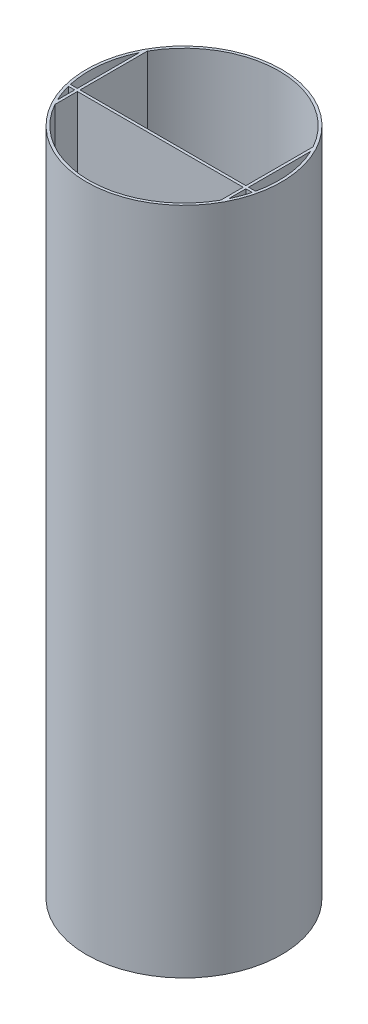
ISO-10303-21;
HEADER;
FILE_DESCRIPTION(('STEP AP214'),'2;1');
FILE_NAME('part.step','',(''),(''),'','','');
FILE_SCHEMA(('AUTOMOTIVE_DESIGN { 1 0 10303 214 1 1 1 1 }'));
ENDSEC;
DATA;
#1=APPLICATION_CONTEXT('core data for automotive mechanical design processes');
#2=APPLICATION_PROTOCOL_DEFINITION('international standard','automotive_design',2000,#1);
#3=PRODUCT_CONTEXT('',#1,'mechanical');
#4=PRODUCT('Part','Part','',(#3));
#5=PRODUCT_RELATED_PRODUCT_CATEGORY('part','',(#4));
#6=PRODUCT_DEFINITION_FORMATION('','',#4);
#7=PRODUCT_DEFINITION_CONTEXT('part definition',#1,'design');
#8=PRODUCT_DEFINITION('design','',#6,#7);
#9=PRODUCT_DEFINITION_SHAPE('','',#8);
#10=(LENGTH_UNIT() NAMED_UNIT(*) SI_UNIT(.MILLI.,.METRE.));
#11=(NAMED_UNIT(*) PLANE_ANGLE_UNIT() SI_UNIT($,.RADIAN.));
#12=(NAMED_UNIT(*) SI_UNIT($,.STERADIAN.) SOLID_ANGLE_UNIT());
#13=UNCERTAINTY_MEASURE_WITH_UNIT(LENGTH_MEASURE(1.E-05),#10,'distance_accuracy_value','');
#14=(GEOMETRIC_REPRESENTATION_CONTEXT(3) GLOBAL_UNCERTAINTY_ASSIGNED_CONTEXT((#13)) GLOBAL_UNIT_ASSIGNED_CONTEXT((#10,
#11,#12)) REPRESENTATION_CONTEXT('',''));
#15=CARTESIAN_POINT('',(0.,0.,0.));
#16=DIRECTION('',(0.,0.,1.));
#17=DIRECTION('',(1.,0.,0.));
#18=AXIS2_PLACEMENT_3D('',#15,#16,#17);
#19=CARTESIAN_POINT('',(0.,500.,0.));
#20=DIRECTION('',(0.,-1.,0.));
#21=DIRECTION('',(0.,0.,-1.));
#22=AXIS2_PLACEMENT_3D('',#19,#20,#21);
#23=CYLINDRICAL_SURFACE('',#22,71.2);
#24=DIRECTION('',(0.,-1.,0.));
#25=VECTOR('',#24,1.);
#26=CARTESIAN_POINT('',(62.2,500.,-34.6496753231542));
#27=LINE('',#26,#25);
#28=CARTESIAN_POINT('',(62.2,40.,-34.6496753231542));
#29=VERTEX_POINT('',#28);
#30=CARTESIAN_POINT('',(62.2,0.,-34.6496753231542));
#31=VERTEX_POINT('',#30);
#32=EDGE_CURVE('E433',#29,#31,#27,.T.);
#33=ORIENTED_EDGE('',*,*,#32,.F.);
#34=CARTESIAN_POINT('',(0.,40.,0.));
#35=DIRECTION('',(0.,1.,0.));
#36=DIRECTION('',(0.,0.,1.));
#37=AXIS2_PLACEMENT_3D('',#34,#35,#36);
#38=CIRCLE('',#37,71.2);
#39=CARTESIAN_POINT('',(-62.2,40.,-34.6496753231542));
#40=VERTEX_POINT('',#39);
#41=EDGE_CURVE('E264',#29,#40,#38,.T.);
#42=ORIENTED_EDGE('',*,*,#41,.T.);
#43=DIRECTION('',(0.,-1.,0.));
#44=VECTOR('',#43,1.);
#45=CARTESIAN_POINT('',(-62.2,500.,-34.6496753231542));
#46=LINE('',#45,#44);
#47=CARTESIAN_POINT('',(-62.2,0.,-34.6496753231542));
#48=VERTEX_POINT('',#47);
#49=EDGE_CURVE('E430',#40,#48,#46,.T.);
#50=ORIENTED_EDGE('',*,*,#49,.T.);
#51=CARTESIAN_POINT('',(0.,0.,0.));
#52=DIRECTION('',(0.,1.,0.));
#53=DIRECTION('',(0.,0.,1.));
#54=AXIS2_PLACEMENT_3D('',#51,#52,#53);
#55=CIRCLE('',#54,71.2);
#56=EDGE_CURVE('E388',#31,#48,#55,.T.);
#57=ORIENTED_EDGE('',*,*,#56,.F.);
#58=EDGE_LOOP('',(#33,#42,#50,#57));
#59=FACE_BOUND('',#58,.T.);
#60=ADVANCED_FACE('F39',(#59),#23,.F.);
#61=CARTESIAN_POINT('',(62.2,500.,0.));
#62=DIRECTION('',(1.,0.,0.));
#63=DIRECTION('',(0.,0.,-1.));
#64=AXIS2_PLACEMENT_3D('',#61,#62,#63);
#65=PLANE('',#64);
#66=DIRECTION('',(0.,0.,-1.));
#67=VECTOR('',#66,1.);
#68=CARTESIAN_POINT('',(62.2,40.,15.8));
#69=LINE('',#68,#67);
#70=CARTESIAN_POINT('',(62.2,40.,15.8));
#71=VERTEX_POINT('',#70);
#72=EDGE_CURVE('E260',#71,#29,#69,.T.);
#73=ORIENTED_EDGE('',*,*,#72,.T.);
#74=ORIENTED_EDGE('',*,*,#32,.T.);
#75=DIRECTION('',(0.,0.,1.));
#76=VECTOR('',#75,1.);
#77=CARTESIAN_POINT('',(62.2,0.,0.));
#78=LINE('',#77,#76);
#79=CARTESIAN_POINT('',(62.2,0.,15.8));
#80=VERTEX_POINT('',#79);
#81=EDGE_CURVE('E391',#31,#80,#78,.T.);
#82=ORIENTED_EDGE('',*,*,#81,.T.);
#83=DIRECTION('',(0.,-1.,0.));
#84=VECTOR('',#83,1.);
#85=CARTESIAN_POINT('',(62.2,500.,15.8));
#86=LINE('',#85,#84);
#87=EDGE_CURVE('E237',#71,#80,#86,.T.);
#88=ORIENTED_EDGE('',*,*,#87,.F.);
#89=EDGE_LOOP('',(#73,#74,#82,#88));
#90=FACE_BOUND('',#89,.T.);
#91=ADVANCED_FACE('F507',(#90),#65,.F.);
#92=CARTESIAN_POINT('',(0.,500.,15.8));
#93=DIRECTION('',(0.,0.,-1.));
#94=DIRECTION('',(-1.,0.,0.));
#95=AXIS2_PLACEMENT_3D('',#92,#93,#94);
#96=PLANE('',#95);
#97=DIRECTION('',(0.,-1.,0.));
#98=VECTOR('',#97,1.);
#99=CARTESIAN_POINT('',(-62.2,500.,15.8));
#100=LINE('',#99,#98);
#101=CARTESIAN_POINT('',(-62.2,40.,15.8));
#102=VERTEX_POINT('',#101);
#103=CARTESIAN_POINT('',(-62.2,0.,15.8));
#104=VERTEX_POINT('',#103);
#105=EDGE_CURVE('E238',#102,#104,#100,.T.);
#106=ORIENTED_EDGE('',*,*,#105,.F.);
#107=DIRECTION('',(1.,0.,0.));
#108=VECTOR('',#107,1.);
#109=CARTESIAN_POINT('',(-62.2,40.,15.8));
#110=LINE('',#109,#108);
#111=EDGE_CURVE('E257',#102,#71,#110,.T.);
#112=ORIENTED_EDGE('',*,*,#111,.T.);
#113=ORIENTED_EDGE('',*,*,#87,.T.);
#114=DIRECTION('',(1.,0.,0.));
#115=VECTOR('',#114,1.);
#116=CARTESIAN_POINT('',(0.,0.,15.8));
#117=LINE('',#116,#115);
#118=EDGE_CURVE('E394',#104,#80,#117,.T.);
#119=ORIENTED_EDGE('',*,*,#118,.F.);
#120=EDGE_LOOP('',(#106,#112,#113,#119));
#121=FACE_BOUND('',#120,.T.);
#122=ADVANCED_FACE('F514',(#121),#96,.T.);
#123=CARTESIAN_POINT('',(-62.2,500.,0.));
#124=DIRECTION('',(1.,0.,0.));
#125=DIRECTION('',(0.,0.,-1.));
#126=AXIS2_PLACEMENT_3D('',#123,#124,#125);
#127=PLANE('',#126);
#128=ORIENTED_EDGE('',*,*,#49,.F.);
#129=DIRECTION('',(0.,0.,1.));
#130=VECTOR('',#129,1.);
#131=CARTESIAN_POINT('',(-62.2,40.,-34.6496753231542));
#132=LINE('',#131,#130);
#133=EDGE_CURVE('E245',#40,#102,#132,.T.);
#134=ORIENTED_EDGE('',*,*,#133,.T.);
#135=ORIENTED_EDGE('',*,*,#105,.T.);
#136=DIRECTION('',(0.,0.,1.));
#137=VECTOR('',#136,1.);
#138=CARTESIAN_POINT('',(-62.2,0.,0.));
#139=LINE('',#138,#137);
#140=EDGE_CURVE('E397',#48,#104,#139,.T.);
#141=ORIENTED_EDGE('',*,*,#140,.F.);
#142=EDGE_LOOP('',(#128,#134,#135,#141));
#143=FACE_BOUND('',#142,.T.);
#144=ADVANCED_FACE('F543',(#143),#127,.T.);
#145=CARTESIAN_POINT('',(0.,500.,0.));
#146=DIRECTION('',(0.,-1.,0.));
#147=DIRECTION('',(0.,0.,-1.));
#148=AXIS2_PLACEMENT_3D('',#145,#146,#147);
#149=CYLINDRICAL_SURFACE('',#148,71.2);
#150=DIRECTION('',(0.,-1.,0.));
#151=VECTOR('',#150,1.);
#152=CARTESIAN_POINT('',(-62.2,500.,34.6496753231542));
#153=LINE('',#152,#151);
#154=CARTESIAN_POINT('',(-62.2,40.,34.6496753231542));
#155=VERTEX_POINT('',#154);
#156=CARTESIAN_POINT('',(-62.2,0.,34.6496753231542));
#157=VERTEX_POINT('',#156);
#158=EDGE_CURVE('E455',#155,#157,#153,.T.);
#159=ORIENTED_EDGE('',*,*,#158,.F.);
#160=CARTESIAN_POINT('',(0.,40.,0.));
#161=DIRECTION('',(0.,1.,0.));
#162=DIRECTION('',(0.,0.,1.));
#163=AXIS2_PLACEMENT_3D('',#160,#161,#162);
#164=CIRCLE('',#163,71.2);
#165=CARTESIAN_POINT('',(62.2,40.,34.6496753231542));
#166=VERTEX_POINT('',#165);
#167=EDGE_CURVE('E285',#155,#166,#164,.T.);
#168=ORIENTED_EDGE('',*,*,#167,.T.);
#169=DIRECTION('',(0.,-1.,0.));
#170=VECTOR('',#169,1.);
#171=CARTESIAN_POINT('',(62.2,500.,34.6496753231542));
#172=LINE('',#171,#170);
#173=CARTESIAN_POINT('',(62.2,0.,34.6496753231542));
#174=VERTEX_POINT('',#173);
#175=EDGE_CURVE('E447',#166,#174,#172,.T.);
#176=ORIENTED_EDGE('',*,*,#175,.T.);
#177=CARTESIAN_POINT('',(0.,0.,0.));
#178=DIRECTION('',(0.,1.,0.));
#179=DIRECTION('',(0.,0.,1.));
#180=AXIS2_PLACEMENT_3D('',#177,#178,#179);
#181=CIRCLE('',#180,71.2);
#182=EDGE_CURVE('E367',#157,#174,#181,.T.);
#183=ORIENTED_EDGE('',*,*,#182,.F.);
#184=EDGE_LOOP('',(#159,#168,#176,#183));
#185=FACE_BOUND('',#184,.T.);
#186=ADVANCED_FACE('F471',(#185),#149,.F.);
#187=CARTESIAN_POINT('',(-62.2,500.,0.));
#188=DIRECTION('',(1.,0.,0.));
#189=DIRECTION('',(0.,0.,-1.));
#190=AXIS2_PLACEMENT_3D('',#187,#188,#189);
#191=PLANE('',#190);
#192=DIRECTION('',(0.,-1.,0.));
#193=VECTOR('',#192,1.);
#194=CARTESIAN_POINT('',(-62.2,500.,17.8));
#195=LINE('',#194,#193);
#196=CARTESIAN_POINT('',(-62.2,40.,17.8));
#197=VERTEX_POINT('',#196);
#198=CARTESIAN_POINT('',(-62.2,0.,17.8));
#199=VERTEX_POINT('',#198);
#200=EDGE_CURVE('E451',#197,#199,#195,.T.);
#201=ORIENTED_EDGE('',*,*,#200,.F.);
#202=DIRECTION('',(0.,0.,1.));
#203=VECTOR('',#202,1.);
#204=CARTESIAN_POINT('',(-62.2,40.,17.8));
#205=LINE('',#204,#203);
#206=EDGE_CURVE('E283',#197,#155,#205,.T.);
#207=ORIENTED_EDGE('',*,*,#206,.T.);
#208=ORIENTED_EDGE('',*,*,#158,.T.);
#209=DIRECTION('',(0.,0.,1.));
#210=VECTOR('',#209,1.);
#211=CARTESIAN_POINT('',(-62.2,0.,0.));
#212=LINE('',#211,#210);
#213=EDGE_CURVE('E370',#199,#157,#212,.T.);
#214=ORIENTED_EDGE('',*,*,#213,.F.);
#215=EDGE_LOOP('',(#201,#207,#208,#214));
#216=FACE_BOUND('',#215,.T.);
#217=ADVANCED_FACE('F484',(#216),#191,.T.);
#218=CARTESIAN_POINT('',(0.,500.,17.8));
#219=DIRECTION('',(0.,0.,-1.));
#220=DIRECTION('',(-1.,0.,0.));
#221=AXIS2_PLACEMENT_3D('',#218,#219,#220);
#222=PLANE('',#221);
#223=DIRECTION('',(-1.,0.,0.));
#224=VECTOR('',#223,1.);
#225=CARTESIAN_POINT('',(62.2,40.,17.8));
#226=LINE('',#225,#224);
#227=CARTESIAN_POINT('',(62.2,40.,17.8));
#228=VERTEX_POINT('',#227);
#229=EDGE_CURVE('E270',#228,#197,#226,.T.);
#230=ORIENTED_EDGE('',*,*,#229,.T.);
#231=ORIENTED_EDGE('',*,*,#200,.T.);
#232=DIRECTION('',(1.,0.,0.));
#233=VECTOR('',#232,1.);
#234=CARTESIAN_POINT('',(0.,0.,17.8));
#235=LINE('',#234,#233);
#236=CARTESIAN_POINT('',(62.2,0.,17.8));
#237=VERTEX_POINT('',#236);
#238=EDGE_CURVE('E373',#199,#237,#235,.T.);
#239=ORIENTED_EDGE('',*,*,#238,.T.);
#240=DIRECTION('',(0.,-1.,0.));
#241=VECTOR('',#240,1.);
#242=CARTESIAN_POINT('',(62.2,500.,17.8));
#243=LINE('',#242,#241);
#244=EDGE_CURVE('E446',#228,#237,#243,.T.);
#245=ORIENTED_EDGE('',*,*,#244,.F.);
#246=EDGE_LOOP('',(#230,#231,#239,#245));
#247=FACE_BOUND('',#246,.T.);
#248=ADVANCED_FACE('F491',(#247),#222,.F.);
#249=CARTESIAN_POINT('',(62.2,500.,0.));
#250=DIRECTION('',(1.,0.,0.));
#251=DIRECTION('',(0.,0.,-1.));
#252=AXIS2_PLACEMENT_3D('',#249,#250,#251);
#253=PLANE('',#252);
#254=DIRECTION('',(0.,0.,-1.));
#255=VECTOR('',#254,1.);
#256=CARTESIAN_POINT('',(62.2,40.,34.6496753231542));
#257=LINE('',#256,#255);
#258=EDGE_CURVE('E275',#166,#228,#257,.T.);
#259=ORIENTED_EDGE('',*,*,#258,.T.);
#260=ORIENTED_EDGE('',*,*,#244,.T.);
#261=DIRECTION('',(0.,0.,1.));
#262=VECTOR('',#261,1.);
#263=CARTESIAN_POINT('',(62.2,0.,0.));
#264=LINE('',#263,#262);
#265=EDGE_CURVE('E376',#237,#174,#264,.T.);
#266=ORIENTED_EDGE('',*,*,#265,.T.);
#267=ORIENTED_EDGE('',*,*,#175,.F.);
#268=EDGE_LOOP('',(#259,#260,#266,#267));
#269=FACE_BOUND('',#268,.T.);
#270=ADVANCED_FACE('F476',(#269),#253,.F.);
#271=CARTESIAN_POINT('',(0.,500.,0.));
#272=DIRECTION('',(0.,-1.,0.));
#273=DIRECTION('',(0.,0.,-1.));
#274=AXIS2_PLACEMENT_3D('',#271,#272,#273);
#275=CYLINDRICAL_SURFACE('',#274,71.2);
#276=CARTESIAN_POINT('',(0.,0.,0.));
#277=DIRECTION('',(0.,1.,0.));
#278=DIRECTION('',(0.,0.,1.));
#279=AXIS2_PLACEMENT_3D('',#276,#277,#278);
#280=CIRCLE('',#279,71.2);
#281=CARTESIAN_POINT('',(-68.939103562492,0.,17.8));
#282=VERTEX_POINT('',#281);
#283=CARTESIAN_POINT('',(-64.2,0.,30.7863606163509));
#284=VERTEX_POINT('',#283);
#285=EDGE_CURVE('E409',#282,#284,#280,.T.);
#286=ORIENTED_EDGE('',*,*,#285,.F.);
#287=DIRECTION('',(0.,-1.,0.));
#288=VECTOR('',#287,1.);
#289=CARTESIAN_POINT('',(-68.939103562492,500.,17.8));
#290=LINE('',#289,#288);
#291=CARTESIAN_POINT('',(-68.939103562492,500.,17.8));
#292=VERTEX_POINT('',#291);
#293=EDGE_CURVE('E11',#292,#282,#290,.T.);
#294=ORIENTED_EDGE('',*,*,#293,.F.);
#295=CARTESIAN_POINT('',(0.,500.,0.));
#296=DIRECTION('',(0.,1.,0.));
#297=DIRECTION('',(0.,0.,1.));
#298=AXIS2_PLACEMENT_3D('',#295,#296,#297);
#299=CIRCLE('',#298,71.2);
#300=CARTESIAN_POINT('',(-64.2,500.,30.7863606163509));
#301=VERTEX_POINT('',#300);
#302=EDGE_CURVE('E349',#292,#301,#299,.T.);
#303=ORIENTED_EDGE('',*,*,#302,.T.);
#304=DIRECTION('',(0.,-1.,0.));
#305=VECTOR('',#304,1.);
#306=CARTESIAN_POINT('',(-64.2,500.,30.7863606163509));
#307=LINE('',#306,#305);
#308=EDGE_CURVE('E416',#301,#284,#307,.T.);
#309=ORIENTED_EDGE('',*,*,#308,.T.);
#310=EDGE_LOOP('',(#286,#294,#303,#309));
#311=FACE_BOUND('',#310,.T.);
#312=ADVANCED_FACE('F499',(#311),#275,.F.);
#313=CARTESIAN_POINT('',(0.,500.,17.8));
#314=DIRECTION('',(0.,0.,-1.));
#315=DIRECTION('',(-1.,0.,0.));
#316=AXIS2_PLACEMENT_3D('',#313,#314,#315);
#317=PLANE('',#316);
#318=DIRECTION('',(1.,0.,0.));
#319=VECTOR('',#318,1.);
#320=CARTESIAN_POINT('',(0.,0.,17.8));
#321=LINE('',#320,#319);
#322=CARTESIAN_POINT('',(-64.2,0.,17.8));
#323=VERTEX_POINT('',#322);
#324=EDGE_CURVE('E411',#282,#323,#321,.T.);
#325=ORIENTED_EDGE('',*,*,#324,.T.);
#326=DIRECTION('',(0.,-1.,0.));
#327=VECTOR('',#326,1.);
#328=CARTESIAN_POINT('',(-64.2,500.,17.8));
#329=LINE('',#328,#327);
#330=CARTESIAN_POINT('',(-64.2,500.,17.8));
#331=VERTEX_POINT('',#330);
#332=EDGE_CURVE('E48',#331,#323,#329,.T.);
#333=ORIENTED_EDGE('',*,*,#332,.F.);
#334=DIRECTION('',(1.,0.,0.));
#335=VECTOR('',#334,1.);
#336=CARTESIAN_POINT('',(0.,500.,17.8));
#337=LINE('',#336,#335);
#338=EDGE_CURVE('E352',#292,#331,#337,.T.);
#339=ORIENTED_EDGE('',*,*,#338,.F.);
#340=ORIENTED_EDGE('',*,*,#293,.T.);
#341=EDGE_LOOP('',(#325,#333,#339,#340));
#342=FACE_BOUND('',#341,.T.);
#343=ADVANCED_FACE('F532',(#342),#317,.F.);
#344=CARTESIAN_POINT('',(0.,500.,0.));
#345=DIRECTION('',(0.,-1.,0.));
#346=DIRECTION('',(0.,0.,-1.));
#347=AXIS2_PLACEMENT_3D('',#344,#345,#346);
#348=CYLINDRICAL_SURFACE('',#347,71.2);
#349=CARTESIAN_POINT('',(0.,0.,0.));
#350=DIRECTION('',(0.,1.,0.));
#351=DIRECTION('',(0.,0.,1.));
#352=AXIS2_PLACEMENT_3D('',#349,#350,#351);
#353=CIRCLE('',#352,71.2);
#354=CARTESIAN_POINT('',(69.4247794378924,0.,15.8));
#355=VERTEX_POINT('',#354);
#356=CARTESIAN_POINT('',(64.2,0.,-30.7863606163508));
#357=VERTEX_POINT('',#356);
#358=EDGE_CURVE('E400',#355,#357,#353,.T.);
#359=ORIENTED_EDGE('',*,*,#358,.F.);
#360=DIRECTION('',(0.,-1.,0.));
#361=VECTOR('',#360,1.);
#362=CARTESIAN_POINT('',(69.4247794378924,500.,15.8));
#363=LINE('',#362,#361);
#364=CARTESIAN_POINT('',(69.4247794378924,500.,15.8));
#365=VERTEX_POINT('',#364);
#366=EDGE_CURVE('E419',#365,#355,#363,.T.);
#367=ORIENTED_EDGE('',*,*,#366,.F.);
#368=CARTESIAN_POINT('',(0.,500.,0.));
#369=DIRECTION('',(0.,1.,0.));
#370=DIRECTION('',(0.,0.,1.));
#371=AXIS2_PLACEMENT_3D('',#368,#369,#370);
#372=CIRCLE('',#371,71.2);
#373=CARTESIAN_POINT('',(64.2,500.,-30.7863606163508));
#374=VERTEX_POINT('',#373);
#375=EDGE_CURVE('E340',#365,#374,#372,.T.);
#376=ORIENTED_EDGE('',*,*,#375,.T.);
#377=DIRECTION('',(0.,-1.,0.));
#378=VECTOR('',#377,1.);
#379=CARTESIAN_POINT('',(64.2,500.,-30.7863606163508));
#380=LINE('',#379,#378);
#381=EDGE_CURVE('E422',#374,#357,#380,.T.);
#382=ORIENTED_EDGE('',*,*,#381,.T.);
#383=EDGE_LOOP('',(#359,#367,#376,#382));
#384=FACE_BOUND('',#383,.T.);
#385=ADVANCED_FACE('F526',(#384),#348,.F.);
#386=CARTESIAN_POINT('',(0.,500.,15.8));
#387=DIRECTION('',(0.,0.,-1.));
#388=DIRECTION('',(-1.,0.,0.));
#389=AXIS2_PLACEMENT_3D('',#386,#387,#388);
#390=PLANE('',#389);
#391=DIRECTION('',(1.,0.,0.));
#392=VECTOR('',#391,1.);
#393=CARTESIAN_POINT('',(0.,0.,15.8));
#394=LINE('',#393,#392);
#395=CARTESIAN_POINT('',(64.2,0.,15.8));
#396=VERTEX_POINT('',#395);
#397=EDGE_CURVE('E403',#396,#355,#394,.T.);
#398=ORIENTED_EDGE('',*,*,#397,.F.);
#399=DIRECTION('',(0.,-1.,0.));
#400=VECTOR('',#399,1.);
#401=CARTESIAN_POINT('',(64.2,500.,15.8));
#402=LINE('',#401,#400);
#403=CARTESIAN_POINT('',(64.2,500.,15.8));
#404=VERTEX_POINT('',#403);
#405=EDGE_CURVE('E424',#404,#396,#402,.T.);
#406=ORIENTED_EDGE('',*,*,#405,.F.);
#407=DIRECTION('',(1.,0.,0.));
#408=VECTOR('',#407,1.);
#409=CARTESIAN_POINT('',(0.,500.,15.8));
#410=LINE('',#409,#408);
#411=EDGE_CURVE('E343',#404,#365,#410,.T.);
#412=ORIENTED_EDGE('',*,*,#411,.T.);
#413=ORIENTED_EDGE('',*,*,#366,.T.);
#414=EDGE_LOOP('',(#398,#406,#412,#413));
#415=FACE_BOUND('',#414,.T.);
#416=ADVANCED_FACE('F521',(#415),#390,.T.);
#417=CARTESIAN_POINT('',(0.,42.,0.));
#418=DIRECTION('',(0.,1.,0.));
#419=DIRECTION('',(0.,0.,1.));
#420=AXIS2_PLACEMENT_3D('',#417,#418,#419);
#421=CIRCLE('',#420,71.2);
#422=CARTESIAN_POINT('',(62.2,42.,-34.6496753231542));
#423=VERTEX_POINT('',#422);
#424=CARTESIAN_POINT('',(-62.2,42.,-34.6496753231542));
#425=VERTEX_POINT('',#424);
#426=EDGE_CURVE('E56',#423,#425,#421,.T.);
#427=ORIENTED_EDGE('',*,*,#426,.F.);
#428=CARTESIAN_POINT('',(62.2,500.,-34.6496753231542));
#429=VERTEX_POINT('',#428);
#430=EDGE_CURVE('E425',#429,#423,#27,.T.);
#431=ORIENTED_EDGE('',*,*,#430,.F.);
#432=CARTESIAN_POINT('',(0.,500.,0.));
#433=DIRECTION('',(0.,1.,0.));
#434=DIRECTION('',(0.,0.,1.));
#435=AXIS2_PLACEMENT_3D('',#432,#433,#434);
#436=CIRCLE('',#435,71.2);
#437=CARTESIAN_POINT('',(-62.2,500.,-34.6496753231542));
#438=VERTEX_POINT('',#437);
#439=EDGE_CURVE('E332',#429,#438,#436,.T.);
#440=ORIENTED_EDGE('',*,*,#439,.T.);
#441=EDGE_CURVE('E429',#438,#425,#46,.T.);
#442=ORIENTED_EDGE('',*,*,#441,.T.);
#443=EDGE_LOOP('',(#427,#431,#440,#442));
#444=FACE_BOUND('',#443,.T.);
#445=ADVANCED_FACE('F510',(#444),#23,.F.);
#446=ORIENTED_EDGE('',*,*,#430,.T.);
#447=DIRECTION('',(0.,0.,-1.));
#448=VECTOR('',#447,1.);
#449=CARTESIAN_POINT('',(62.2,42.,15.8));
#450=LINE('',#449,#448);
#451=CARTESIAN_POINT('',(62.2,42.,15.8));
#452=VERTEX_POINT('',#451);
#453=EDGE_CURVE('E63',#452,#423,#450,.T.);
#454=ORIENTED_EDGE('',*,*,#453,.F.);
#455=CARTESIAN_POINT('',(62.2,500.,15.8));
#456=VERTEX_POINT('',#455);
#457=EDGE_CURVE('E243',#456,#452,#86,.T.);
#458=ORIENTED_EDGE('',*,*,#457,.F.);
#459=DIRECTION('',(0.,0.,1.));
#460=VECTOR('',#459,1.);
#461=CARTESIAN_POINT('',(62.2,500.,0.));
#462=LINE('',#461,#460);
#463=EDGE_CURVE('E335',#429,#456,#462,.T.);
#464=ORIENTED_EDGE('',*,*,#463,.F.);
#465=EDGE_LOOP('',(#446,#454,#458,#464));
#466=FACE_BOUND('',#465,.T.);
#467=ADVANCED_FACE('F517',(#466),#65,.F.);
#468=DIRECTION('',(1.,0.,0.));
#469=VECTOR('',#468,1.);
#470=CARTESIAN_POINT('',(-62.2,42.,15.8));
#471=LINE('',#470,#469);
#472=CARTESIAN_POINT('',(-62.2,42.,15.8));
#473=VERTEX_POINT('',#472);
#474=EDGE_CURVE('E241',#473,#452,#471,.T.);
#475=ORIENTED_EDGE('',*,*,#474,.F.);
#476=CARTESIAN_POINT('',(-62.2,500.,15.8));
#477=VERTEX_POINT('',#476);
#478=EDGE_CURVE('E227',#477,#473,#100,.T.);
#479=ORIENTED_EDGE('',*,*,#478,.F.);
#480=DIRECTION('',(1.,0.,0.));
#481=VECTOR('',#480,1.);
#482=CARTESIAN_POINT('',(0.,500.,15.8));
#483=LINE('',#482,#481);
#484=EDGE_CURVE('E337',#477,#456,#483,.T.);
#485=ORIENTED_EDGE('',*,*,#484,.T.);
#486=ORIENTED_EDGE('',*,*,#457,.T.);
#487=EDGE_LOOP('',(#475,#479,#485,#486));
#488=FACE_BOUND('',#487,.T.);
#489=ADVANCED_FACE('F242',(#488),#96,.T.);
#490=CARTESIAN_POINT('',(0.,500.,0.));
#491=DIRECTION('',(0.,-1.,0.));
#492=DIRECTION('',(0.,0.,-1.));
#493=AXIS2_PLACEMENT_3D('',#490,#491,#492);
#494=CYLINDRICAL_SURFACE('',#493,71.2);
#495=CARTESIAN_POINT('',(0.,0.,0.));
#496=DIRECTION('',(0.,1.,0.));
#497=DIRECTION('',(0.,0.,1.));
#498=AXIS2_PLACEMENT_3D('',#495,#496,#497);
#499=CIRCLE('',#498,71.2);
#500=CARTESIAN_POINT('',(64.2,0.,30.7863606163508));
#501=VERTEX_POINT('',#500);
#502=CARTESIAN_POINT('',(68.939103562492,0.,17.8));
#503=VERTEX_POINT('',#502);
#504=EDGE_CURVE('E379',#501,#503,#499,.T.);
#505=ORIENTED_EDGE('',*,*,#504,.F.);
#506=DIRECTION('',(0.,-1.,0.));
#507=VECTOR('',#506,1.);
#508=CARTESIAN_POINT('',(64.2,500.,30.7863606163508));
#509=LINE('',#508,#507);
#510=CARTESIAN_POINT('',(64.2,500.,30.7863606163508));
#511=VERTEX_POINT('',#510);
#512=EDGE_CURVE('E440',#511,#501,#509,.T.);
#513=ORIENTED_EDGE('',*,*,#512,.F.);
#514=CARTESIAN_POINT('',(0.,500.,0.));
#515=DIRECTION('',(0.,1.,0.));
#516=DIRECTION('',(0.,0.,1.));
#517=AXIS2_PLACEMENT_3D('',#514,#515,#516);
#518=CIRCLE('',#517,71.2);
#519=CARTESIAN_POINT('',(68.939103562492,500.,17.8));
#520=VERTEX_POINT('',#519);
#521=EDGE_CURVE('E324',#511,#520,#518,.T.);
#522=ORIENTED_EDGE('',*,*,#521,.T.);
#523=DIRECTION('',(0.,-1.,0.));
#524=VECTOR('',#523,1.);
#525=CARTESIAN_POINT('',(68.939103562492,500.,17.8));
#526=LINE('',#525,#524);
#527=EDGE_CURVE('E435',#520,#503,#526,.T.);
#528=ORIENTED_EDGE('',*,*,#527,.T.);
#529=EDGE_LOOP('',(#505,#513,#522,#528));
#530=FACE_BOUND('',#529,.T.);
#531=ADVANCED_FACE('F545',(#530),#494,.F.);
#532=CARTESIAN_POINT('',(64.2,500.,0.));
#533=DIRECTION('',(1.,0.,0.));
#534=DIRECTION('',(0.,0.,-1.));
#535=AXIS2_PLACEMENT_3D('',#532,#533,#534);
#536=PLANE('',#535);
#537=DIRECTION('',(0.,0.,1.));
#538=VECTOR('',#537,1.);
#539=CARTESIAN_POINT('',(64.2,0.,0.));
#540=LINE('',#539,#538);
#541=CARTESIAN_POINT('',(64.2,0.,17.8));
#542=VERTEX_POINT('',#541);
#543=EDGE_CURVE('E382',#542,#501,#540,.T.);
#544=ORIENTED_EDGE('',*,*,#543,.F.);
#545=DIRECTION('',(0.,-1.,0.));
#546=VECTOR('',#545,1.);
#547=CARTESIAN_POINT('',(64.2,500.,17.8));
#548=LINE('',#547,#546);
#549=CARTESIAN_POINT('',(64.2,500.,17.8));
#550=VERTEX_POINT('',#549);
#551=EDGE_CURVE('E437',#550,#542,#548,.T.);
#552=ORIENTED_EDGE('',*,*,#551,.F.);
#553=DIRECTION('',(0.,0.,1.));
#554=VECTOR('',#553,1.);
#555=CARTESIAN_POINT('',(64.2,500.,0.));
#556=LINE('',#555,#554);
#557=EDGE_CURVE('E327',#550,#511,#556,.T.);
#558=ORIENTED_EDGE('',*,*,#557,.T.);
#559=ORIENTED_EDGE('',*,*,#512,.T.);
#560=EDGE_LOOP('',(#544,#552,#558,#559));
#561=FACE_BOUND('',#560,.T.);
#562=ADVANCED_FACE('F549',(#561),#536,.T.);
#563=CARTESIAN_POINT('',(0.,42.,0.));
#564=DIRECTION('',(0.,1.,0.));
#565=DIRECTION('',(0.,0.,1.));
#566=AXIS2_PLACEMENT_3D('',#563,#564,#565);
#567=CIRCLE('',#566,71.2);
#568=CARTESIAN_POINT('',(-62.2,42.,34.6496753231542));
#569=VERTEX_POINT('',#568);
#570=CARTESIAN_POINT('',(62.2,42.,34.6496753231542));
#571=VERTEX_POINT('',#570);
#572=EDGE_CURVE('E277',#569,#571,#567,.T.);
#573=ORIENTED_EDGE('',*,*,#572,.F.);
#574=CARTESIAN_POINT('',(-62.2,500.,34.6496753231542));
#575=VERTEX_POINT('',#574);
#576=EDGE_CURVE('E438',#575,#569,#153,.T.);
#577=ORIENTED_EDGE('',*,*,#576,.F.);
#578=CARTESIAN_POINT('',(0.,500.,0.));
#579=DIRECTION('',(0.,1.,0.));
#580=DIRECTION('',(0.,0.,1.));
#581=AXIS2_PLACEMENT_3D('',#578,#579,#580);
#582=CIRCLE('',#581,71.2);
#583=CARTESIAN_POINT('',(62.2,500.,34.6496753231542));
#584=VERTEX_POINT('',#583);
#585=EDGE_CURVE('E313',#575,#584,#582,.T.);
#586=ORIENTED_EDGE('',*,*,#585,.T.);
#587=EDGE_CURVE('E443',#584,#571,#172,.T.);
#588=ORIENTED_EDGE('',*,*,#587,.T.);
#589=EDGE_LOOP('',(#573,#577,#586,#588));
#590=FACE_BOUND('',#589,.T.);
#591=ADVANCED_FACE('F790',(#590),#149,.F.);
#592=DIRECTION('',(0.,0.,1.));
#593=VECTOR('',#592,1.);
#594=CARTESIAN_POINT('',(-62.2,42.,17.8));
#595=LINE('',#594,#593);
#596=CARTESIAN_POINT('',(-62.2,42.,17.8));
#597=VERTEX_POINT('',#596);
#598=EDGE_CURVE('E274',#597,#569,#595,.T.);
#599=ORIENTED_EDGE('',*,*,#598,.F.);
#600=CARTESIAN_POINT('',(-62.2,500.,17.8));
#601=VERTEX_POINT('',#600);
#602=EDGE_CURVE('E452',#601,#597,#195,.T.);
#603=ORIENTED_EDGE('',*,*,#602,.F.);
#604=DIRECTION('',(0.,0.,1.));
#605=VECTOR('',#604,1.);
#606=CARTESIAN_POINT('',(-62.2,500.,0.));
#607=LINE('',#606,#605);
#608=EDGE_CURVE('E316',#601,#575,#607,.T.);
#609=ORIENTED_EDGE('',*,*,#608,.T.);
#610=ORIENTED_EDGE('',*,*,#576,.T.);
#611=EDGE_LOOP('',(#599,#603,#609,#610));
#612=FACE_BOUND('',#611,.T.);
#613=ADVANCED_FACE('F503',(#612),#191,.T.);
#614=ORIENTED_EDGE('',*,*,#602,.T.);
#615=DIRECTION('',(-1.,0.,0.));
#616=VECTOR('',#615,1.);
#617=CARTESIAN_POINT('',(62.2,42.,17.8));
#618=LINE('',#617,#616);
#619=CARTESIAN_POINT('',(62.2,42.,17.8));
#620=VERTEX_POINT('',#619);
#621=EDGE_CURVE('E272',#620,#597,#618,.T.);
#622=ORIENTED_EDGE('',*,*,#621,.F.);
#623=CARTESIAN_POINT('',(62.2,500.,17.8));
#624=VERTEX_POINT('',#623);
#625=EDGE_CURVE('E448',#624,#620,#243,.T.);
#626=ORIENTED_EDGE('',*,*,#625,.F.);
#627=DIRECTION('',(1.,0.,0.));
#628=VECTOR('',#627,1.);
#629=CARTESIAN_POINT('',(0.,500.,17.8));
#630=LINE('',#629,#628);
#631=EDGE_CURVE('E319',#601,#624,#630,.T.);
#632=ORIENTED_EDGE('',*,*,#631,.F.);
#633=EDGE_LOOP('',(#614,#622,#626,#632));
#634=FACE_BOUND('',#633,.T.);
#635=ADVANCED_FACE('F494',(#634),#222,.F.);
#636=CARTESIAN_POINT('',(0.,500.,0.));
#637=DIRECTION('',(0.,-1.,0.));
#638=DIRECTION('',(0.,0.,-1.));
#639=AXIS2_PLACEMENT_3D('',#636,#637,#638);
#640=CYLINDRICAL_SURFACE('',#639,71.2);
#641=CARTESIAN_POINT('',(0.,0.,0.));
#642=DIRECTION('',(0.,1.,0.));
#643=DIRECTION('',(0.,0.,1.));
#644=AXIS2_PLACEMENT_3D('',#641,#642,#643);
#645=CIRCLE('',#644,71.2);
#646=CARTESIAN_POINT('',(-64.2,0.,-30.7863606163509));
#647=VERTEX_POINT('',#646);
#648=CARTESIAN_POINT('',(-69.4247794378924,0.,15.8));
#649=VERTEX_POINT('',#648);
#650=EDGE_CURVE('E303',#647,#649,#645,.T.);
#651=ORIENTED_EDGE('',*,*,#650,.F.);
#652=DIRECTION('',(0.,-1.,0.));
#653=VECTOR('',#652,1.);
#654=CARTESIAN_POINT('',(-64.2,500.,-30.7863606163509));
#655=LINE('',#654,#653);
#656=CARTESIAN_POINT('',(-64.2,500.,-30.7863606163509));
#657=VERTEX_POINT('',#656);
#658=EDGE_CURVE('E43',#657,#647,#655,.T.);
#659=ORIENTED_EDGE('',*,*,#658,.F.);
#660=CARTESIAN_POINT('',(0.,500.,0.));
#661=DIRECTION('',(0.,1.,0.));
#662=DIRECTION('',(0.,0.,1.));
#663=AXIS2_PLACEMENT_3D('',#660,#661,#662);
#664=CIRCLE('',#663,71.2);
#665=CARTESIAN_POINT('',(-69.4247794378924,500.,15.8));
#666=VERTEX_POINT('',#665);
#667=EDGE_CURVE('E304',#657,#666,#664,.T.);
#668=ORIENTED_EDGE('',*,*,#667,.T.);
#669=DIRECTION('',(0.,-1.,0.));
#670=VECTOR('',#669,1.);
#671=CARTESIAN_POINT('',(-69.4247794378924,500.,15.8));
#672=LINE('',#671,#670);
#673=EDGE_CURVE('E360',#666,#649,#672,.T.);
#674=ORIENTED_EDGE('',*,*,#673,.T.);
#675=EDGE_LOOP('',(#651,#659,#668,#674));
#676=FACE_BOUND('',#675,.T.);
#677=ADVANCED_FACE('F41',(#676),#640,.F.);
#678=CARTESIAN_POINT('',(-64.2,500.,0.));
#679=DIRECTION('',(1.,0.,0.));
#680=DIRECTION('',(0.,0.,-1.));
#681=AXIS2_PLACEMENT_3D('',#678,#679,#680);
#682=PLANE('',#681);
#683=DIRECTION('',(0.,0.,1.));
#684=VECTOR('',#683,1.);
#685=CARTESIAN_POINT('',(-64.2,0.,0.));
#686=LINE('',#685,#684);
#687=CARTESIAN_POINT('',(-64.2,0.,15.8));
#688=VERTEX_POINT('',#687);
#689=EDGE_CURVE('E362',#647,#688,#686,.T.);
#690=ORIENTED_EDGE('',*,*,#689,.T.);
#691=DIRECTION('',(0.,-1.,0.));
#692=VECTOR('',#691,1.);
#693=CARTESIAN_POINT('',(-64.2,500.,15.8));
#694=LINE('',#693,#692);
#695=CARTESIAN_POINT('',(-64.2,500.,15.8));
#696=VERTEX_POINT('',#695);
#697=EDGE_CURVE('E459',#696,#688,#694,.T.);
#698=ORIENTED_EDGE('',*,*,#697,.F.);
#699=DIRECTION('',(0.,0.,1.));
#700=VECTOR('',#699,1.);
#701=CARTESIAN_POINT('',(-64.2,500.,0.));
#702=LINE('',#701,#700);
#703=EDGE_CURVE('E307',#657,#696,#702,.T.);
#704=ORIENTED_EDGE('',*,*,#703,.F.);
#705=ORIENTED_EDGE('',*,*,#658,.T.);
#706=EDGE_LOOP('',(#690,#698,#704,#705));
#707=FACE_BOUND('',#706,.T.);
#708=ADVANCED_FACE('F629',(#707),#682,.F.);
#709=CARTESIAN_POINT('',(-64.2,500.,0.));
#710=DIRECTION('',(1.,0.,0.));
#711=DIRECTION('',(0.,0.,-1.));
#712=AXIS2_PLACEMENT_3D('',#709,#710,#711);
#713=PLANE('',#712);
#714=DIRECTION('',(0.,0.,1.));
#715=VECTOR('',#714,1.);
#716=CARTESIAN_POINT('',(-64.2,0.,0.));
#717=LINE('',#716,#715);
#718=EDGE_CURVE('E308',#323,#284,#717,.T.);
#719=ORIENTED_EDGE('',*,*,#718,.T.);
#720=ORIENTED_EDGE('',*,*,#308,.F.);
#721=DIRECTION('',(0.,0.,1.));
#722=VECTOR('',#721,1.);
#723=CARTESIAN_POINT('',(-64.2,500.,0.));
#724=LINE('',#723,#722);
#725=EDGE_CURVE('E355',#331,#301,#724,.T.);
#726=ORIENTED_EDGE('',*,*,#725,.F.);
#727=ORIENTED_EDGE('',*,*,#332,.T.);
#728=EDGE_LOOP('',(#719,#720,#726,#727));
#729=FACE_BOUND('',#728,.T.);
#730=ADVANCED_FACE('F626',(#729),#713,.F.);
#731=CARTESIAN_POINT('',(64.2,500.,0.));
#732=DIRECTION('',(1.,0.,0.));
#733=DIRECTION('',(0.,0.,-1.));
#734=AXIS2_PLACEMENT_3D('',#731,#732,#733);
#735=PLANE('',#734);
#736=DIRECTION('',(0.,0.,1.));
#737=VECTOR('',#736,1.);
#738=CARTESIAN_POINT('',(64.2,0.,0.));
#739=LINE('',#738,#737);
#740=EDGE_CURVE('E406',#357,#396,#739,.T.);
#741=ORIENTED_EDGE('',*,*,#740,.F.);
#742=ORIENTED_EDGE('',*,*,#381,.F.);
#743=DIRECTION('',(0.,0.,1.));
#744=VECTOR('',#743,1.);
#745=CARTESIAN_POINT('',(64.2,500.,0.));
#746=LINE('',#745,#744);
#747=EDGE_CURVE('E346',#374,#404,#746,.T.);
#748=ORIENTED_EDGE('',*,*,#747,.T.);
#749=ORIENTED_EDGE('',*,*,#405,.T.);
#750=EDGE_LOOP('',(#741,#742,#748,#749));
#751=FACE_BOUND('',#750,.T.);
#752=ADVANCED_FACE('F537',(#751),#735,.T.);
#753=DIRECTION('',(0.,0.,1.));
#754=VECTOR('',#753,1.);
#755=CARTESIAN_POINT('',(-62.2,42.,-34.6496753231542));
#756=LINE('',#755,#754);
#757=EDGE_CURVE('E231',#425,#473,#756,.T.);
#758=ORIENTED_EDGE('',*,*,#757,.F.);
#759=ORIENTED_EDGE('',*,*,#441,.F.);
#760=DIRECTION('',(0.,0.,1.));
#761=VECTOR('',#760,1.);
#762=CARTESIAN_POINT('',(-62.2,500.,0.));
#763=LINE('',#762,#761);
#764=EDGE_CURVE('E233',#438,#477,#763,.T.);
#765=ORIENTED_EDGE('',*,*,#764,.T.);
#766=ORIENTED_EDGE('',*,*,#478,.T.);
#767=EDGE_LOOP('',(#758,#759,#765,#766));
#768=FACE_BOUND('',#767,.T.);
#769=ADVANCED_FACE('F229',(#768),#127,.T.);
#770=CARTESIAN_POINT('',(0.,500.,17.8));
#771=DIRECTION('',(0.,0.,-1.));
#772=DIRECTION('',(-1.,0.,0.));
#773=AXIS2_PLACEMENT_3D('',#770,#771,#772);
#774=PLANE('',#773);
#775=DIRECTION('',(1.,0.,0.));
#776=VECTOR('',#775,1.);
#777=CARTESIAN_POINT('',(0.,0.,17.8));
#778=LINE('',#777,#776);
#779=EDGE_CURVE('E385',#542,#503,#778,.T.);
#780=ORIENTED_EDGE('',*,*,#779,.T.);
#781=ORIENTED_EDGE('',*,*,#527,.F.);
#782=DIRECTION('',(1.,0.,0.));
#783=VECTOR('',#782,1.);
#784=CARTESIAN_POINT('',(0.,500.,17.8));
#785=LINE('',#784,#783);
#786=EDGE_CURVE('E330',#550,#520,#785,.T.);
#787=ORIENTED_EDGE('',*,*,#786,.F.);
#788=ORIENTED_EDGE('',*,*,#551,.T.);
#789=EDGE_LOOP('',(#780,#781,#787,#788));
#790=FACE_BOUND('',#789,.T.);
#791=ADVANCED_FACE('F542',(#790),#774,.F.);
#792=ORIENTED_EDGE('',*,*,#625,.T.);
#793=DIRECTION('',(0.,0.,-1.));
#794=VECTOR('',#793,1.);
#795=CARTESIAN_POINT('',(62.2,42.,34.6496753231542));
#796=LINE('',#795,#794);
#797=EDGE_CURVE('E279',#571,#620,#796,.T.);
#798=ORIENTED_EDGE('',*,*,#797,.F.);
#799=ORIENTED_EDGE('',*,*,#587,.F.);
#800=DIRECTION('',(0.,0.,1.));
#801=VECTOR('',#800,1.);
#802=CARTESIAN_POINT('',(62.2,500.,0.));
#803=LINE('',#802,#801);
#804=EDGE_CURVE('E322',#624,#584,#803,.T.);
#805=ORIENTED_EDGE('',*,*,#804,.F.);
#806=EDGE_LOOP('',(#792,#798,#799,#805));
#807=FACE_BOUND('',#806,.T.);
#808=ADVANCED_FACE('F501',(#807),#253,.F.);
#809=CARTESIAN_POINT('',(0.,500.,15.8));
#810=DIRECTION('',(0.,0.,-1.));
#811=DIRECTION('',(-1.,0.,0.));
#812=AXIS2_PLACEMENT_3D('',#809,#810,#811);
#813=PLANE('',#812);
#814=DIRECTION('',(1.,0.,0.));
#815=VECTOR('',#814,1.);
#816=CARTESIAN_POINT('',(0.,0.,15.8));
#817=LINE('',#816,#815);
#818=EDGE_CURVE('E365',#649,#688,#817,.T.);
#819=ORIENTED_EDGE('',*,*,#818,.F.);
#820=ORIENTED_EDGE('',*,*,#673,.F.);
#821=DIRECTION('',(1.,0.,0.));
#822=VECTOR('',#821,1.);
#823=CARTESIAN_POINT('',(0.,500.,15.8));
#824=LINE('',#823,#822);
#825=EDGE_CURVE('E310',#666,#696,#824,.T.);
#826=ORIENTED_EDGE('',*,*,#825,.T.);
#827=ORIENTED_EDGE('',*,*,#697,.T.);
#828=EDGE_LOOP('',(#819,#820,#826,#827));
#829=FACE_BOUND('',#828,.T.);
#830=ADVANCED_FACE('F624',(#829),#813,.T.);
#831=CARTESIAN_POINT('',(0.,500.,0.));
#832=DIRECTION('',(0.,-1.,0.));
#833=DIRECTION('',(0.,0.,-1.));
#834=AXIS2_PLACEMENT_3D('',#831,#832,#833);
#835=CYLINDRICAL_SURFACE('',#834,73.2);
#836=CARTESIAN_POINT('',(0.,500.,0.));
#837=DIRECTION('',(0.,1.,0.));
#838=DIRECTION('',(0.,0.,1.));
#839=AXIS2_PLACEMENT_3D('',#836,#837,#838);
#840=CIRCLE('',#839,73.2);
#841=CARTESIAN_POINT('',(0.,500.,73.2));
#842=VERTEX_POINT('',#841);
#843=EDGE_CURVE('E357',#842,#842,#840,.T.);
#844=ORIENTED_EDGE('',*,*,#843,.F.);
#845=EDGE_LOOP('',(#844));
#846=FACE_BOUND('',#845,.T.);
#847=CARTESIAN_POINT('',(0.,-2.,0.));
#848=DIRECTION('',(0.,-1.,0.));
#849=DIRECTION('',(0.,0.,-1.));
#850=AXIS2_PLACEMENT_3D('',#847,#848,#849);
#851=CIRCLE('',#850,73.2);
#852=CARTESIAN_POINT('',(0.,-2.,-73.2));
#853=VERTEX_POINT('',#852);
#854=EDGE_CURVE('E298',#853,#853,#851,.T.);
#855=ORIENTED_EDGE('',*,*,#854,.F.);
#856=EDGE_LOOP('',(#855));
#857=FACE_BOUND('',#856,.T.);
#858=ADVANCED_FACE('F620',(#846,#857),#835,.T.);
#859=CARTESIAN_POINT('',(0.,500.,0.));
#860=DIRECTION('',(0.,1.,0.));
#861=DIRECTION('',(0.,0.,1.));
#862=AXIS2_PLACEMENT_3D('',#859,#860,#861);
#863=PLANE('',#862);
#864=ORIENTED_EDGE('',*,*,#667,.F.);
#865=ORIENTED_EDGE('',*,*,#703,.T.);
#866=ORIENTED_EDGE('',*,*,#825,.F.);
#867=EDGE_LOOP('',(#864,#865,#866));
#868=FACE_BOUND('',#867,.T.);
#869=ORIENTED_EDGE('',*,*,#585,.F.);
#870=ORIENTED_EDGE('',*,*,#608,.F.);
#871=ORIENTED_EDGE('',*,*,#631,.T.);
#872=ORIENTED_EDGE('',*,*,#804,.T.);
#873=EDGE_LOOP('',(#869,#870,#871,#872));
#874=FACE_BOUND('',#873,.T.);
#875=ORIENTED_EDGE('',*,*,#521,.F.);
#876=ORIENTED_EDGE('',*,*,#557,.F.);
#877=ORIENTED_EDGE('',*,*,#786,.T.);
#878=EDGE_LOOP('',(#875,#876,#877));
#879=FACE_BOUND('',#878,.T.);
#880=ORIENTED_EDGE('',*,*,#439,.F.);
#881=ORIENTED_EDGE('',*,*,#463,.T.);
#882=ORIENTED_EDGE('',*,*,#484,.F.);
#883=ORIENTED_EDGE('',*,*,#764,.F.);
#884=EDGE_LOOP('',(#880,#881,#882,#883));
#885=FACE_BOUND('',#884,.T.);
#886=ORIENTED_EDGE('',*,*,#375,.F.);
#887=ORIENTED_EDGE('',*,*,#411,.F.);
#888=ORIENTED_EDGE('',*,*,#747,.F.);
#889=EDGE_LOOP('',(#886,#887,#888));
#890=FACE_BOUND('',#889,.T.);
#891=ORIENTED_EDGE('',*,*,#302,.F.);
#892=ORIENTED_EDGE('',*,*,#338,.T.);
#893=ORIENTED_EDGE('',*,*,#725,.T.);
#894=EDGE_LOOP('',(#891,#892,#893));
#895=FACE_BOUND('',#894,.T.);
#896=ORIENTED_EDGE('',*,*,#843,.T.);
#897=EDGE_LOOP('',(#896));
#898=FACE_BOUND('',#897,.T.);
#899=ADVANCED_FACE('F617',(#868,#874,#879,#885,#890,#895,#898),#863,.T.);
#900=CARTESIAN_POINT('',(0.,0.,0.));
#901=DIRECTION('',(0.,-1.,0.));
#902=DIRECTION('',(0.,0.,-1.));
#903=AXIS2_PLACEMENT_3D('',#900,#901,#902);
#904=PLANE('',#903);
#905=ORIENTED_EDGE('',*,*,#324,.F.);
#906=ORIENTED_EDGE('',*,*,#285,.T.);
#907=ORIENTED_EDGE('',*,*,#718,.F.);
#908=EDGE_LOOP('',(#905,#906,#907));
#909=FACE_BOUND('',#908,.T.);
#910=ADVANCED_FACE('F616',(#909),#904,.F.);
#911=ORIENTED_EDGE('',*,*,#397,.T.);
#912=ORIENTED_EDGE('',*,*,#358,.T.);
#913=ORIENTED_EDGE('',*,*,#740,.T.);
#914=EDGE_LOOP('',(#911,#912,#913));
#915=FACE_BOUND('',#914,.T.);
#916=ADVANCED_FACE('F603',(#915),#904,.F.);
#917=CARTESIAN_POINT('',(0.,-2.,41.5));
#918=DIRECTION('',(0.,1.,0.));
#919=DIRECTION('',(0.,0.,1.));
#920=AXIS2_PLACEMENT_3D('',#917,#918,#919);
#921=CYLINDRICAL_SURFACE('',#920,2.);
#922=CARTESIAN_POINT('',(0.,-2.,41.5));
#923=DIRECTION('',(0.,-1.,0.));
#924=DIRECTION('',(0.,0.,-1.));
#925=AXIS2_PLACEMENT_3D('',#922,#923,#924);
#926=CIRCLE('',#925,2.);
#927=CARTESIAN_POINT('',(0.,-2.,39.5));
#928=VERTEX_POINT('',#927);
#929=EDGE_CURVE('E289',#928,#928,#926,.T.);
#930=ORIENTED_EDGE('',*,*,#929,.T.);
#931=EDGE_LOOP('',(#930));
#932=FACE_BOUND('',#931,.T.);
#933=CARTESIAN_POINT('',(0.,0.,41.5));
#934=DIRECTION('',(0.,-1.,0.));
#935=DIRECTION('',(0.,0.,-1.));
#936=AXIS2_PLACEMENT_3D('',#933,#934,#935);
#937=CIRCLE('',#936,2.);
#938=CARTESIAN_POINT('',(0.,0.,39.5));
#939=VERTEX_POINT('',#938);
#940=EDGE_CURVE('E281',#939,#939,#937,.T.);
#941=ORIENTED_EDGE('',*,*,#940,.F.);
#942=EDGE_LOOP('',(#941));
#943=FACE_BOUND('',#942,.T.);
#944=ADVANCED_FACE('F599',(#932,#943),#921,.F.);
#945=CARTESIAN_POINT('',(0.,-2.,-27.7));
#946=DIRECTION('',(0.,1.,0.));
#947=DIRECTION('',(0.,0.,1.));
#948=AXIS2_PLACEMENT_3D('',#945,#946,#947);
#949=CYLINDRICAL_SURFACE('',#948,2.);
#950=CARTESIAN_POINT('',(0.,-2.,-27.7));
#951=DIRECTION('',(0.,-1.,0.));
#952=DIRECTION('',(0.,0.,-1.));
#953=AXIS2_PLACEMENT_3D('',#950,#951,#952);
#954=CIRCLE('',#953,2.);
#955=CARTESIAN_POINT('',(0.,-2.,-29.7));
#956=VERTEX_POINT('',#955);
#957=EDGE_CURVE('E295',#956,#956,#954,.T.);
#958=ORIENTED_EDGE('',*,*,#957,.T.);
#959=EDGE_LOOP('',(#958));
#960=FACE_BOUND('',#959,.T.);
#961=CARTESIAN_POINT('',(0.,0.,-27.7));
#962=DIRECTION('',(0.,-1.,0.));
#963=DIRECTION('',(0.,0.,-1.));
#964=AXIS2_PLACEMENT_3D('',#961,#962,#963);
#965=CIRCLE('',#964,2.);
#966=CARTESIAN_POINT('',(0.,0.,-29.7));
#967=VERTEX_POINT('',#966);
#968=EDGE_CURVE('E292',#967,#967,#965,.T.);
#969=ORIENTED_EDGE('',*,*,#968,.F.);
#970=EDGE_LOOP('',(#969));
#971=FACE_BOUND('',#970,.T.);
#972=ADVANCED_FACE('F602',(#960,#971),#949,.F.);
#973=CARTESIAN_POINT('',(0.,-2.,0.));
#974=DIRECTION('',(0.,-1.,0.));
#975=DIRECTION('',(0.,0.,-1.));
#976=AXIS2_PLACEMENT_3D('',#973,#974,#975);
#977=PLANE('',#976);
#978=ORIENTED_EDGE('',*,*,#957,.F.);
#979=EDGE_LOOP('',(#978));
#980=FACE_BOUND('',#979,.T.);
#981=ORIENTED_EDGE('',*,*,#854,.T.);
#982=EDGE_LOOP('',(#981));
#983=FACE_BOUND('',#982,.T.);
#984=ORIENTED_EDGE('',*,*,#929,.F.);
#985=EDGE_LOOP('',(#984));
#986=FACE_BOUND('',#985,.T.);
#987=ADVANCED_FACE('F607',(#980,#983,#986),#977,.T.);
#988=ORIENTED_EDGE('',*,*,#968,.T.);
#989=EDGE_LOOP('',(#988));
#990=FACE_BOUND('',#989,.T.);
#991=ORIENTED_EDGE('',*,*,#81,.F.);
#992=ORIENTED_EDGE('',*,*,#56,.T.);
#993=ORIENTED_EDGE('',*,*,#140,.T.);
#994=ORIENTED_EDGE('',*,*,#118,.T.);
#995=EDGE_LOOP('',(#991,#992,#993,#994));
#996=FACE_BOUND('',#995,.T.);
#997=ADVANCED_FACE('F565',(#990,#996),#904,.F.);
#998=ORIENTED_EDGE('',*,*,#940,.T.);
#999=EDGE_LOOP('',(#998));
#1000=FACE_BOUND('',#999,.T.);
#1001=ORIENTED_EDGE('',*,*,#213,.T.);
#1002=ORIENTED_EDGE('',*,*,#182,.T.);
#1003=ORIENTED_EDGE('',*,*,#265,.F.);
#1004=ORIENTED_EDGE('',*,*,#238,.F.);
#1005=EDGE_LOOP('',(#1001,#1002,#1003,#1004));
#1006=FACE_BOUND('',#1005,.T.);
#1007=ADVANCED_FACE('F480',(#1000,#1006),#904,.F.);
#1008=ORIENTED_EDGE('',*,*,#543,.T.);
#1009=ORIENTED_EDGE('',*,*,#504,.T.);
#1010=ORIENTED_EDGE('',*,*,#779,.F.);
#1011=EDGE_LOOP('',(#1008,#1009,#1010));
#1012=FACE_BOUND('',#1011,.T.);
#1013=ADVANCED_FACE('F614',(#1012),#904,.F.);
#1014=ORIENTED_EDGE('',*,*,#689,.F.);
#1015=ORIENTED_EDGE('',*,*,#650,.T.);
#1016=ORIENTED_EDGE('',*,*,#818,.T.);
#1017=EDGE_LOOP('',(#1014,#1015,#1016));
#1018=FACE_BOUND('',#1017,.T.);
#1019=ADVANCED_FACE('F595',(#1018),#904,.F.);
#1020=CARTESIAN_POINT('',(0.,42.,0.));
#1021=DIRECTION('',(0.,1.,0.));
#1022=DIRECTION('',(0.,0.,1.));
#1023=AXIS2_PLACEMENT_3D('',#1020,#1021,#1022);
#1024=PLANE('',#1023);
#1025=ORIENTED_EDGE('',*,*,#621,.T.);
#1026=ORIENTED_EDGE('',*,*,#598,.T.);
#1027=ORIENTED_EDGE('',*,*,#572,.T.);
#1028=ORIENTED_EDGE('',*,*,#797,.T.);
#1029=EDGE_LOOP('',(#1025,#1026,#1027,#1028));
#1030=FACE_BOUND('',#1029,.T.);
#1031=CARTESIAN_POINT('',(0.,42.,41.5));
#1032=DIRECTION('',(0.,1.,0.));
#1033=DIRECTION('',(0.,0.,1.));
#1034=AXIS2_PLACEMENT_3D('',#1031,#1032,#1033);
#1035=CIRCLE('',#1034,2.);
#1036=CARTESIAN_POINT('',(0.,42.,43.5));
#1037=VERTEX_POINT('',#1036);
#1038=EDGE_CURVE('E252',#1037,#1037,#1035,.T.);
#1039=ORIENTED_EDGE('',*,*,#1038,.F.);
#1040=EDGE_LOOP('',(#1039));
#1041=FACE_BOUND('',#1040,.T.);
#1042=ADVANCED_FACE('F592',(#1030,#1041),#1024,.T.);
#1043=CARTESIAN_POINT('',(0.,40.,0.));
#1044=DIRECTION('',(0.,1.,0.));
#1045=DIRECTION('',(0.,0.,1.));
#1046=AXIS2_PLACEMENT_3D('',#1043,#1044,#1045);
#1047=PLANE('',#1046);
#1048=ORIENTED_EDGE('',*,*,#229,.F.);
#1049=ORIENTED_EDGE('',*,*,#258,.F.);
#1050=ORIENTED_EDGE('',*,*,#167,.F.);
#1051=ORIENTED_EDGE('',*,*,#206,.F.);
#1052=EDGE_LOOP('',(#1048,#1049,#1050,#1051));
#1053=FACE_BOUND('',#1052,.T.);
#1054=CARTESIAN_POINT('',(0.,40.,41.5));
#1055=DIRECTION('',(0.,1.,0.));
#1056=DIRECTION('',(0.,0.,1.));
#1057=AXIS2_PLACEMENT_3D('',#1054,#1055,#1056);
#1058=CIRCLE('',#1057,2.);
#1059=CARTESIAN_POINT('',(0.,40.,43.5));
#1060=VERTEX_POINT('',#1059);
#1061=EDGE_CURVE('E249',#1060,#1060,#1058,.T.);
#1062=ORIENTED_EDGE('',*,*,#1061,.T.);
#1063=EDGE_LOOP('',(#1062));
#1064=FACE_BOUND('',#1063,.T.);
#1065=ADVANCED_FACE('F488',(#1053,#1064),#1047,.F.);
#1066=CARTESIAN_POINT('',(0.,42.,41.5));
#1067=DIRECTION('',(0.,-1.,0.));
#1068=DIRECTION('',(0.,0.,-1.));
#1069=AXIS2_PLACEMENT_3D('',#1066,#1067,#1068);
#1070=CYLINDRICAL_SURFACE('',#1069,2.);
#1071=ORIENTED_EDGE('',*,*,#1038,.T.);
#1072=EDGE_LOOP('',(#1071));
#1073=FACE_BOUND('',#1072,.T.);
#1074=ORIENTED_EDGE('',*,*,#1061,.F.);
#1075=EDGE_LOOP('',(#1074));
#1076=FACE_BOUND('',#1075,.T.);
#1077=ADVANCED_FACE('F583',(#1073,#1076),#1070,.F.);
#1078=CARTESIAN_POINT('',(0.,42.,0.));
#1079=DIRECTION('',(0.,1.,0.));
#1080=DIRECTION('',(0.,0.,1.));
#1081=AXIS2_PLACEMENT_3D('',#1078,#1079,#1080);
#1082=PLANE('',#1081);
#1083=ORIENTED_EDGE('',*,*,#474,.T.);
#1084=ORIENTED_EDGE('',*,*,#453,.T.);
#1085=ORIENTED_EDGE('',*,*,#426,.T.);
#1086=ORIENTED_EDGE('',*,*,#757,.T.);
#1087=EDGE_LOOP('',(#1083,#1084,#1085,#1086));
#1088=FACE_BOUND('',#1087,.T.);
#1089=CARTESIAN_POINT('',(0.,42.,-27.7));
#1090=DIRECTION('',(0.,1.,0.));
#1091=DIRECTION('',(0.,0.,1.));
#1092=AXIS2_PLACEMENT_3D('',#1089,#1090,#1091);
#1093=CIRCLE('',#1092,2.);
#1094=CARTESIAN_POINT('',(0.,42.,-25.7));
#1095=VERTEX_POINT('',#1094);
#1096=EDGE_CURVE('E261',#1095,#1095,#1093,.T.);
#1097=ORIENTED_EDGE('',*,*,#1096,.F.);
#1098=EDGE_LOOP('',(#1097));
#1099=FACE_BOUND('',#1098,.T.);
#1100=ADVANCED_FACE('F247',(#1088,#1099),#1082,.T.);
#1101=CARTESIAN_POINT('',(0.,40.,0.));
#1102=DIRECTION('',(0.,1.,0.));
#1103=DIRECTION('',(0.,0.,1.));
#1104=AXIS2_PLACEMENT_3D('',#1101,#1102,#1103);
#1105=PLANE('',#1104);
#1106=ORIENTED_EDGE('',*,*,#111,.F.);
#1107=ORIENTED_EDGE('',*,*,#133,.F.);
#1108=ORIENTED_EDGE('',*,*,#41,.F.);
#1109=ORIENTED_EDGE('',*,*,#72,.F.);
#1110=EDGE_LOOP('',(#1106,#1107,#1108,#1109));
#1111=FACE_BOUND('',#1110,.T.);
#1112=CARTESIAN_POINT('',(0.,40.,-27.7));
#1113=DIRECTION('',(0.,1.,0.));
#1114=DIRECTION('',(0.,0.,1.));
#1115=AXIS2_PLACEMENT_3D('',#1112,#1113,#1114);
#1116=CIRCLE('',#1115,2.);
#1117=CARTESIAN_POINT('',(0.,40.,-25.7));
#1118=VERTEX_POINT('',#1117);
#1119=EDGE_CURVE('E575',#1118,#1118,#1116,.T.);
#1120=ORIENTED_EDGE('',*,*,#1119,.T.);
#1121=EDGE_LOOP('',(#1120));
#1122=FACE_BOUND('',#1121,.T.);
#1123=ADVANCED_FACE('F568',(#1111,#1122),#1105,.F.);
#1124=CARTESIAN_POINT('',(0.,42.,-27.7));
#1125=DIRECTION('',(0.,-1.,0.));
#1126=DIRECTION('',(0.,0.,-1.));
#1127=AXIS2_PLACEMENT_3D('',#1124,#1125,#1126);
#1128=CYLINDRICAL_SURFACE('',#1127,2.);
#1129=ORIENTED_EDGE('',*,*,#1096,.T.);
#1130=EDGE_LOOP('',(#1129));
#1131=FACE_BOUND('',#1130,.T.);
#1132=ORIENTED_EDGE('',*,*,#1119,.F.);
#1133=EDGE_LOOP('',(#1132));
#1134=FACE_BOUND('',#1133,.T.);
#1135=ADVANCED_FACE('F571',(#1131,#1134),#1128,.F.);
#1136=CLOSED_SHELL('',(#60,#91,#122,#144,#186,#217,#248,#270,#312,#343,#385,#416,#445,#467,#489,
#531,#562,#591,#613,#635,#677,#708,#730,#752,#769,#791,#808,#830,#858,#899,#910,#916,#944,#972,
#987,#997,#1007,#1013,#1019,#1042,#1065,#1077,#1100,#1123,#1135));
#1137=MANIFOLD_SOLID_BREP('B2',#1136);
#1138=ADVANCED_BREP_SHAPE_REPRESENTATION('',(#18,#1137),#14);
#1139=SHAPE_DEFINITION_REPRESENTATION(#9,#1138);
ENDSEC;
END-ISO-10303-21;
